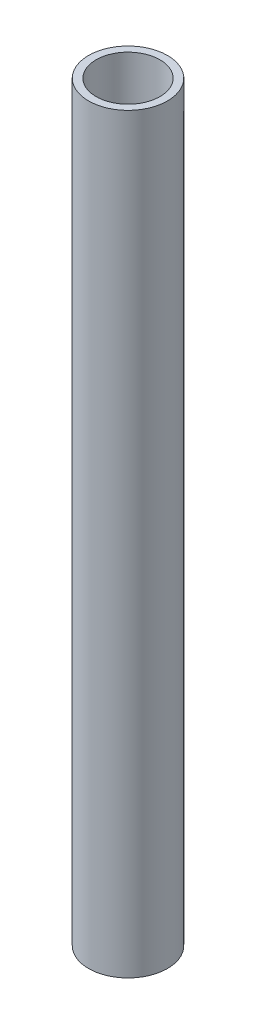
ISO-10303-21;
HEADER;
FILE_DESCRIPTION(('STEP AP214'),'2;1');
FILE_NAME('part.step','',(''),(''),'','','');
FILE_SCHEMA(('AUTOMOTIVE_DESIGN { 1 0 10303 214 1 1 1 1 }'));
ENDSEC;
DATA;
#1=APPLICATION_CONTEXT('core data for automotive mechanical design processes');
#2=APPLICATION_PROTOCOL_DEFINITION('international standard','automotive_design',2000,#1);
#3=PRODUCT_CONTEXT('',#1,'mechanical');
#4=PRODUCT('Part','Part','',(#3));
#5=PRODUCT_RELATED_PRODUCT_CATEGORY('part','',(#4));
#6=PRODUCT_DEFINITION_FORMATION('','',#4);
#7=PRODUCT_DEFINITION_CONTEXT('part definition',#1,'design');
#8=PRODUCT_DEFINITION('design','',#6,#7);
#9=PRODUCT_DEFINITION_SHAPE('','',#8);
#10=(LENGTH_UNIT() NAMED_UNIT(*) SI_UNIT(.MILLI.,.METRE.));
#11=(NAMED_UNIT(*) PLANE_ANGLE_UNIT() SI_UNIT($,.RADIAN.));
#12=(NAMED_UNIT(*) SI_UNIT($,.STERADIAN.) SOLID_ANGLE_UNIT());
#13=UNCERTAINTY_MEASURE_WITH_UNIT(LENGTH_MEASURE(1.E-05),#10,'distance_accuracy_value','');
#14=(GEOMETRIC_REPRESENTATION_CONTEXT(3) GLOBAL_UNCERTAINTY_ASSIGNED_CONTEXT((#13)) GLOBAL_UNIT_ASSIGNED_CONTEXT((#10,
#11,#12)) REPRESENTATION_CONTEXT('',''));
#15=CARTESIAN_POINT('',(0.,0.,0.));
#16=DIRECTION('',(0.,0.,1.));
#17=DIRECTION('',(1.,0.,0.));
#18=AXIS2_PLACEMENT_3D('',#15,#16,#17);
#19=CARTESIAN_POINT('',(0.,200.,0.));
#20=DIRECTION('',(0.,-1.,0.));
#21=DIRECTION('',(0.,0.,-1.));
#22=AXIS2_PLACEMENT_3D('',#19,#20,#21);
#23=CYLINDRICAL_SURFACE('',#22,8.5);
#24=CARTESIAN_POINT('',(0.,0.,0.));
#25=DIRECTION('',(0.,-1.,0.));
#26=DIRECTION('',(0.,0.,-1.));
#27=AXIS2_PLACEMENT_3D('',#24,#25,#26);
#28=CIRCLE('',#27,8.5);
#29=CARTESIAN_POINT('',(0.,0.,-8.5));
#30=VERTEX_POINT('',#29);
#31=EDGE_CURVE('E27',#30,#30,#28,.T.);
#32=ORIENTED_EDGE('',*,*,#31,.T.);
#33=EDGE_LOOP('',(#32));
#34=FACE_BOUND('',#33,.T.);
#35=CARTESIAN_POINT('',(0.,200.,0.));
#36=DIRECTION('',(0.,-1.,0.));
#37=DIRECTION('',(0.,0.,-1.));
#38=AXIS2_PLACEMENT_3D('',#35,#36,#37);
#39=CIRCLE('',#38,8.5);
#40=CARTESIAN_POINT('',(0.,200.,-8.5));
#41=VERTEX_POINT('',#40);
#42=EDGE_CURVE('E18',#41,#41,#39,.T.);
#43=ORIENTED_EDGE('',*,*,#42,.F.);
#44=EDGE_LOOP('',(#43));
#45=FACE_BOUND('',#44,.T.);
#46=ADVANCED_FACE('F15',(#34,#45),#23,.F.);
#47=CARTESIAN_POINT('',(0.,200.,0.));
#48=DIRECTION('',(0.,1.,0.));
#49=DIRECTION('',(0.,0.,1.));
#50=AXIS2_PLACEMENT_3D('',#47,#48,#49);
#51=PLANE('',#50);
#52=ORIENTED_EDGE('',*,*,#42,.T.);
#53=EDGE_LOOP('',(#52));
#54=FACE_BOUND('',#53,.T.);
#55=CARTESIAN_POINT('',(0.,200.,0.));
#56=DIRECTION('',(0.,-1.,0.));
#57=DIRECTION('',(0.,0.,-1.));
#58=AXIS2_PLACEMENT_3D('',#55,#56,#57);
#59=CIRCLE('',#58,10.5);
#60=CARTESIAN_POINT('',(0.,200.,-10.5));
#61=VERTEX_POINT('',#60);
#62=EDGE_CURVE('E22',#61,#61,#59,.T.);
#63=ORIENTED_EDGE('',*,*,#62,.F.);
#64=EDGE_LOOP('',(#63));
#65=FACE_BOUND('',#64,.T.);
#66=ADVANCED_FACE('F35',(#54,#65),#51,.T.);
#67=CARTESIAN_POINT('',(0.,0.,0.));
#68=DIRECTION('',(0.,1.,0.));
#69=DIRECTION('',(0.,0.,1.));
#70=AXIS2_PLACEMENT_3D('',#67,#68,#69);
#71=PLANE('',#70);
#72=ORIENTED_EDGE('',*,*,#31,.F.);
#73=EDGE_LOOP('',(#72));
#74=FACE_BOUND('',#73,.T.);
#75=CARTESIAN_POINT('',(0.,0.,0.));
#76=DIRECTION('',(0.,-1.,0.));
#77=DIRECTION('',(0.,0.,-1.));
#78=AXIS2_PLACEMENT_3D('',#75,#76,#77);
#79=CIRCLE('',#78,10.5);
#80=CARTESIAN_POINT('',(0.,0.,-10.5));
#81=VERTEX_POINT('',#80);
#82=EDGE_CURVE('E10',#81,#81,#79,.F.);
#83=ORIENTED_EDGE('',*,*,#82,.F.);
#84=EDGE_LOOP('',(#83));
#85=FACE_BOUND('',#84,.T.);
#86=ADVANCED_FACE('F43',(#74,#85),#71,.F.);
#87=CARTESIAN_POINT('',(0.,200.,0.));
#88=DIRECTION('',(0.,-1.,0.));
#89=DIRECTION('',(0.,0.,-1.));
#90=AXIS2_PLACEMENT_3D('',#87,#88,#89);
#91=CYLINDRICAL_SURFACE('',#90,10.5);
#92=ORIENTED_EDGE('',*,*,#82,.T.);
#93=EDGE_LOOP('',(#92));
#94=FACE_BOUND('',#93,.T.);
#95=ORIENTED_EDGE('',*,*,#62,.T.);
#96=EDGE_LOOP('',(#95));
#97=FACE_BOUND('',#96,.T.);
#98=ADVANCED_FACE('F44',(#94,#97),#91,.T.);
#99=CLOSED_SHELL('',(#46,#66,#86,#98));
#100=MANIFOLD_SOLID_BREP('B1',#99);
#101=ADVANCED_BREP_SHAPE_REPRESENTATION('',(#18,#100),#14);
#102=SHAPE_DEFINITION_REPRESENTATION(#9,#101);
ENDSEC;
END-ISO-10303-21;
